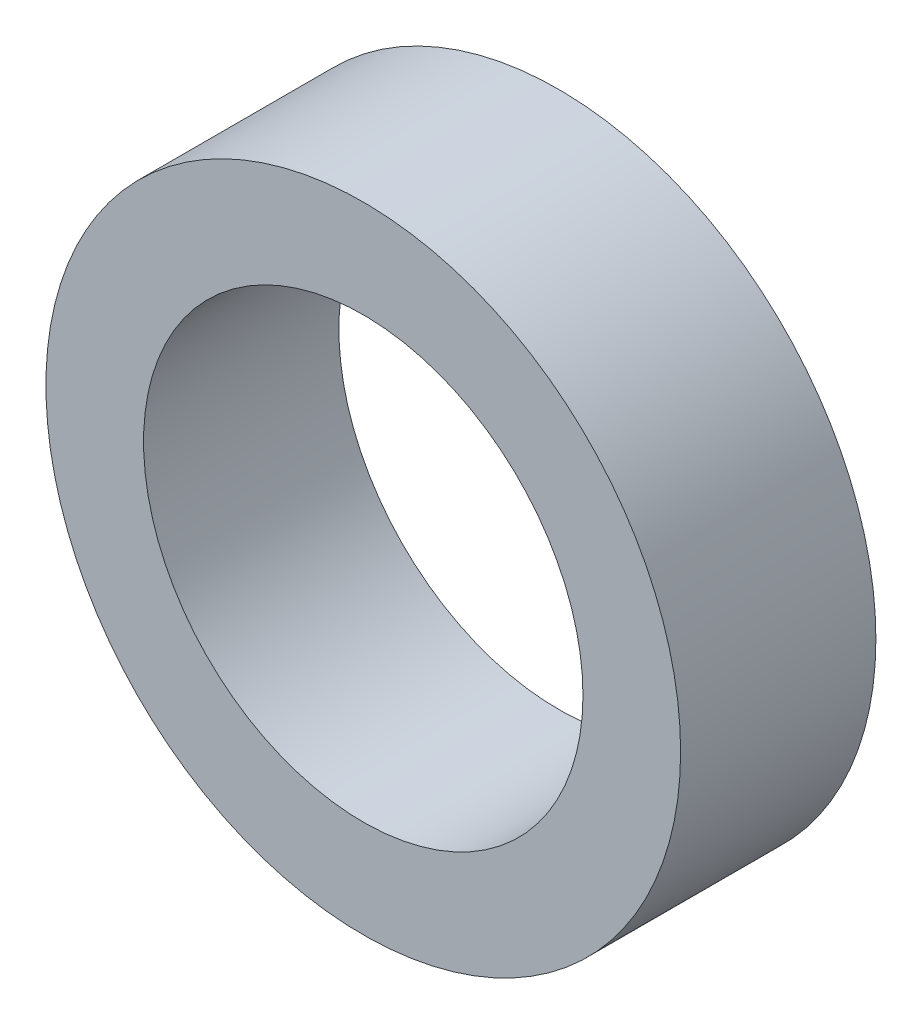
ISO-10303-21;
HEADER;
FILE_DESCRIPTION(('STEP AP214'),'2;1');
FILE_NAME('part.step','',(''),(''),'','','');
FILE_SCHEMA(('AUTOMOTIVE_DESIGN { 1 0 10303 214 1 1 1 1 }'));
ENDSEC;
DATA;
#1=APPLICATION_CONTEXT('core data for automotive mechanical design processes');
#2=APPLICATION_PROTOCOL_DEFINITION('international standard','automotive_design',2000,#1);
#3=PRODUCT_CONTEXT('',#1,'mechanical');
#4=PRODUCT('Part','Part','',(#3));
#5=PRODUCT_RELATED_PRODUCT_CATEGORY('part','',(#4));
#6=PRODUCT_DEFINITION_FORMATION('','',#4);
#7=PRODUCT_DEFINITION_CONTEXT('part definition',#1,'design');
#8=PRODUCT_DEFINITION('design','',#6,#7);
#9=PRODUCT_DEFINITION_SHAPE('','',#8);
#10=(LENGTH_UNIT() NAMED_UNIT(*) SI_UNIT(.MILLI.,.METRE.));
#11=(NAMED_UNIT(*) PLANE_ANGLE_UNIT() SI_UNIT($,.RADIAN.));
#12=(NAMED_UNIT(*) SI_UNIT($,.STERADIAN.) SOLID_ANGLE_UNIT());
#13=UNCERTAINTY_MEASURE_WITH_UNIT(LENGTH_MEASURE(1.E-05),#10,'distance_accuracy_value','');
#14=(GEOMETRIC_REPRESENTATION_CONTEXT(3) GLOBAL_UNCERTAINTY_ASSIGNED_CONTEXT((#13)) GLOBAL_UNIT_ASSIGNED_CONTEXT((#10,
#11,#12)) REPRESENTATION_CONTEXT('',''));
#15=CARTESIAN_POINT('',(0.,0.,0.));
#16=DIRECTION('',(0.,0.,1.));
#17=DIRECTION('',(1.,0.,0.));
#18=AXIS2_PLACEMENT_3D('',#15,#16,#17);
#19=CARTESIAN_POINT('',(0.,0.,4.));
#20=DIRECTION('',(0.,0.,1.));
#21=DIRECTION('',(1.,0.,0.));
#22=AXIS2_PLACEMENT_3D('',#19,#20,#21);
#23=PLANE('',#22);
#24=CARTESIAN_POINT('',(0.,0.,4.));
#25=DIRECTION('',(0.,0.,1.));
#26=DIRECTION('',(1.,0.,0.));
#27=AXIS2_PLACEMENT_3D('',#24,#25,#26);
#28=CIRCLE('',#27,6.5);
#29=CARTESIAN_POINT('',(6.5,0.,4.));
#30=VERTEX_POINT('',#29);
#31=EDGE_CURVE('E10',#30,#30,#28,.T.);
#32=ORIENTED_EDGE('',*,*,#31,.T.);
#33=EDGE_LOOP('',(#32));
#34=FACE_BOUND('',#33,.T.);
#35=CARTESIAN_POINT('',(0.,0.,4.));
#36=DIRECTION('',(0.,0.,1.));
#37=DIRECTION('',(1.,0.,0.));
#38=AXIS2_PLACEMENT_3D('',#35,#36,#37);
#39=CIRCLE('',#38,4.5);
#40=CARTESIAN_POINT('',(4.5,0.,4.));
#41=VERTEX_POINT('',#40);
#42=EDGE_CURVE('E43',#41,#41,#39,.T.);
#43=ORIENTED_EDGE('',*,*,#42,.F.);
#44=EDGE_LOOP('',(#43));
#45=FACE_BOUND('',#44,.T.);
#46=ADVANCED_FACE('F32',(#34,#45),#23,.T.);
#47=CARTESIAN_POINT('',(0.,0.,0.));
#48=DIRECTION('',(0.,0.,1.));
#49=DIRECTION('',(1.,0.,0.));
#50=AXIS2_PLACEMENT_3D('',#47,#48,#49);
#51=PLANE('',#50);
#52=CARTESIAN_POINT('',(0.,0.,0.));
#53=DIRECTION('',(0.,0.,1.));
#54=DIRECTION('',(1.,0.,0.));
#55=AXIS2_PLACEMENT_3D('',#52,#53,#54);
#56=CIRCLE('',#55,6.5);
#57=CARTESIAN_POINT('',(6.5,0.,0.));
#58=VERTEX_POINT('',#57);
#59=EDGE_CURVE('E36',#58,#58,#56,.T.);
#60=ORIENTED_EDGE('',*,*,#59,.F.);
#61=EDGE_LOOP('',(#60));
#62=FACE_BOUND('',#61,.T.);
#63=CARTESIAN_POINT('',(0.,0.,0.));
#64=DIRECTION('',(0.,0.,1.));
#65=DIRECTION('',(1.,0.,0.));
#66=AXIS2_PLACEMENT_3D('',#63,#64,#65);
#67=CIRCLE('',#66,4.5);
#68=CARTESIAN_POINT('',(4.5,0.,0.));
#69=VERTEX_POINT('',#68);
#70=EDGE_CURVE('E45',#69,#69,#67,.T.);
#71=ORIENTED_EDGE('',*,*,#70,.T.);
#72=EDGE_LOOP('',(#71));
#73=FACE_BOUND('',#72,.T.);
#74=ADVANCED_FACE('F55',(#62,#73),#51,.F.);
#75=CARTESIAN_POINT('',(0.,0.,4.));
#76=DIRECTION('',(0.,0.,-1.));
#77=DIRECTION('',(-1.,0.,0.));
#78=AXIS2_PLACEMENT_3D('',#75,#76,#77);
#79=CYLINDRICAL_SURFACE('',#78,6.5);
#80=ORIENTED_EDGE('',*,*,#31,.F.);
#81=EDGE_LOOP('',(#80));
#82=FACE_BOUND('',#81,.T.);
#83=ORIENTED_EDGE('',*,*,#59,.T.);
#84=EDGE_LOOP('',(#83));
#85=FACE_BOUND('',#84,.T.);
#86=ADVANCED_FACE('F34',(#82,#85),#79,.T.);
#87=CARTESIAN_POINT('',(0.,0.,4.));
#88=DIRECTION('',(0.,0.,-1.));
#89=DIRECTION('',(-1.,0.,0.));
#90=AXIS2_PLACEMENT_3D('',#87,#88,#89);
#91=CYLINDRICAL_SURFACE('',#90,4.5);
#92=ORIENTED_EDGE('',*,*,#42,.T.);
#93=EDGE_LOOP('',(#92));
#94=FACE_BOUND('',#93,.T.);
#95=ORIENTED_EDGE('',*,*,#70,.F.);
#96=EDGE_LOOP('',(#95));
#97=FACE_BOUND('',#96,.T.);
#98=ADVANCED_FACE('F51',(#94,#97),#91,.F.);
#99=CLOSED_SHELL('',(#46,#74,#86,#98));
#100=MANIFOLD_SOLID_BREP('B2',#99);
#101=ADVANCED_BREP_SHAPE_REPRESENTATION('',(#18,#100),#14);
#102=SHAPE_DEFINITION_REPRESENTATION(#9,#101);
ENDSEC;
END-ISO-10303-21;
